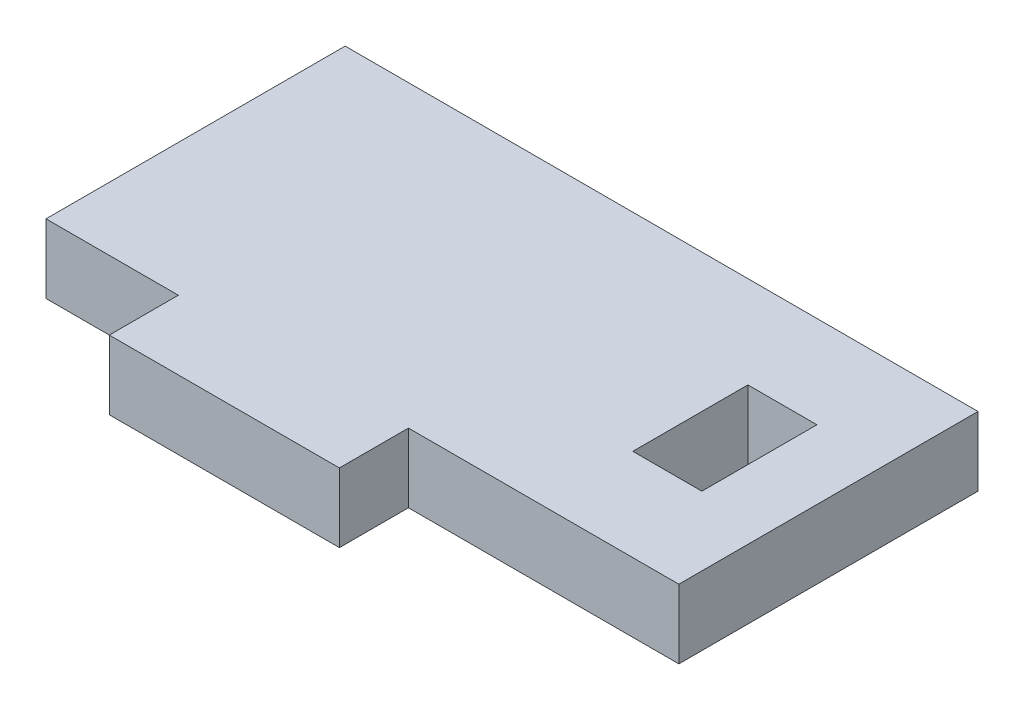
ISO-10303-21;
HEADER;
FILE_DESCRIPTION(('STEP AP214'),'2;1');
FILE_NAME('part.step','',(''),(''),'','','');
FILE_SCHEMA(('AUTOMOTIVE_DESIGN { 1 0 10303 214 1 1 1 1 }'));
ENDSEC;
DATA;
#1=APPLICATION_CONTEXT('core data for automotive mechanical design processes');
#2=APPLICATION_PROTOCOL_DEFINITION('international standard','automotive_design',2000,#1);
#3=PRODUCT_CONTEXT('',#1,'mechanical');
#4=PRODUCT('Part','Part','',(#3));
#5=PRODUCT_RELATED_PRODUCT_CATEGORY('part','',(#4));
#6=PRODUCT_DEFINITION_FORMATION('','',#4);
#7=PRODUCT_DEFINITION_CONTEXT('part definition',#1,'design');
#8=PRODUCT_DEFINITION('design','',#6,#7);
#9=PRODUCT_DEFINITION_SHAPE('','',#8);
#10=(LENGTH_UNIT() NAMED_UNIT(*) SI_UNIT(.MILLI.,.METRE.));
#11=(NAMED_UNIT(*) PLANE_ANGLE_UNIT() SI_UNIT($,.RADIAN.));
#12=(NAMED_UNIT(*) SI_UNIT($,.STERADIAN.) SOLID_ANGLE_UNIT());
#13=UNCERTAINTY_MEASURE_WITH_UNIT(LENGTH_MEASURE(1.E-05),#10,'distance_accuracy_value','');
#14=(GEOMETRIC_REPRESENTATION_CONTEXT(3) GLOBAL_UNCERTAINTY_ASSIGNED_CONTEXT((#13)) GLOBAL_UNIT_ASSIGNED_CONTEXT((#10,
#11,#12)) REPRESENTATION_CONTEXT('',''));
#15=CARTESIAN_POINT('',(0.,0.,0.));
#16=DIRECTION('',(0.,0.,1.));
#17=DIRECTION('',(1.,0.,0.));
#18=AXIS2_PLACEMENT_3D('',#15,#16,#17);
#19=CARTESIAN_POINT('',(0.,3.,0.));
#20=DIRECTION('',(0.,1.,0.));
#21=DIRECTION('',(0.,0.,1.));
#22=AXIS2_PLACEMENT_3D('',#19,#20,#21);
#23=PLANE('',#22);
#24=DIRECTION('',(0.,0.,1.));
#25=VECTOR('',#24,1.);
#26=CARTESIAN_POINT('',(-27.5,3.,-13.));
#27=LINE('',#26,#25);
#28=CARTESIAN_POINT('',(-27.5,3.,-13.));
#29=VERTEX_POINT('',#28);
#30=CARTESIAN_POINT('',(-27.5,3.,0.));
#31=VERTEX_POINT('',#30);
#32=EDGE_CURVE('E158',#29,#31,#27,.T.);
#33=ORIENTED_EDGE('',*,*,#32,.T.);
#34=DIRECTION('',(1.,0.,0.));
#35=VECTOR('',#34,1.);
#36=CARTESIAN_POINT('',(-27.5,3.,0.));
#37=LINE('',#36,#35);
#38=CARTESIAN_POINT('',(-21.75,3.,0.));
#39=VERTEX_POINT('',#38);
#40=EDGE_CURVE('E161',#31,#39,#37,.T.);
#41=ORIENTED_EDGE('',*,*,#40,.T.);
#42=DIRECTION('',(0.,0.,1.));
#43=VECTOR('',#42,1.);
#44=CARTESIAN_POINT('',(-21.75,3.,0.));
#45=LINE('',#44,#43);
#46=CARTESIAN_POINT('',(-21.75,3.,3.));
#47=VERTEX_POINT('',#46);
#48=EDGE_CURVE('E164',#39,#47,#45,.T.);
#49=ORIENTED_EDGE('',*,*,#48,.T.);
#50=DIRECTION('',(1.,0.,0.));
#51=VECTOR('',#50,1.);
#52=CARTESIAN_POINT('',(-21.75,3.,3.));
#53=LINE('',#52,#51);
#54=CARTESIAN_POINT('',(-11.75,3.,3.));
#55=VERTEX_POINT('',#54);
#56=EDGE_CURVE('E166',#47,#55,#53,.T.);
#57=ORIENTED_EDGE('',*,*,#56,.T.);
#58=DIRECTION('',(0.,0.,-1.));
#59=VECTOR('',#58,1.);
#60=CARTESIAN_POINT('',(-11.75,3.,3.));
#61=LINE('',#60,#59);
#62=CARTESIAN_POINT('',(-11.75,3.,0.));
#63=VERTEX_POINT('',#62);
#64=EDGE_CURVE('E168',#55,#63,#61,.T.);
#65=ORIENTED_EDGE('',*,*,#64,.T.);
#66=DIRECTION('',(1.,0.,0.));
#67=VECTOR('',#66,1.);
#68=CARTESIAN_POINT('',(-11.75,3.,0.));
#69=LINE('',#68,#67);
#70=CARTESIAN_POINT('',(0.,3.,0.));
#71=VERTEX_POINT('',#70);
#72=EDGE_CURVE('E170',#63,#71,#69,.T.);
#73=ORIENTED_EDGE('',*,*,#72,.T.);
#74=DIRECTION('',(0.,0.,-1.));
#75=VECTOR('',#74,1.);
#76=CARTESIAN_POINT('',(0.,3.,-13.));
#77=LINE('',#76,#75);
#78=CARTESIAN_POINT('',(0.,3.,-13.));
#79=VERTEX_POINT('',#78);
#80=EDGE_CURVE('E172',#71,#79,#77,.T.);
#81=ORIENTED_EDGE('',*,*,#80,.T.);
#82=DIRECTION('',(-1.,0.,0.));
#83=VECTOR('',#82,1.);
#84=CARTESIAN_POINT('',(-27.5,3.,-13.));
#85=LINE('',#84,#83);
#86=EDGE_CURVE('E174',#79,#29,#85,.T.);
#87=ORIENTED_EDGE('',*,*,#86,.T.);
#88=EDGE_LOOP('',(#33,#41,#49,#57,#65,#73,#81,#87));
#89=FACE_BOUND('',#88,.T.);
#90=DIRECTION('',(-1.,0.,0.));
#91=VECTOR('',#90,1.);
#92=CARTESIAN_POINT('',(-3.,3.,-9.));
#93=LINE('',#92,#91);
#94=CARTESIAN_POINT('',(-3.,3.,-9.));
#95=VERTEX_POINT('',#94);
#96=CARTESIAN_POINT('',(-6.,3.,-9.));
#97=VERTEX_POINT('',#96);
#98=EDGE_CURVE('E130',#95,#97,#93,.T.);
#99=ORIENTED_EDGE('',*,*,#98,.F.);
#100=DIRECTION('',(0.,0.,-1.));
#101=VECTOR('',#100,1.);
#102=CARTESIAN_POINT('',(-3.,3.,-4.));
#103=LINE('',#102,#101);
#104=CARTESIAN_POINT('',(-3.,3.,-4.));
#105=VERTEX_POINT('',#104);
#106=EDGE_CURVE('E122',#105,#95,#103,.T.);
#107=ORIENTED_EDGE('',*,*,#106,.F.);
#108=DIRECTION('',(1.,0.,0.));
#109=VECTOR('',#108,1.);
#110=CARTESIAN_POINT('',(-6.,3.,-4.));
#111=LINE('',#110,#109);
#112=CARTESIAN_POINT('',(-6.,3.,-4.));
#113=VERTEX_POINT('',#112);
#114=EDGE_CURVE('E144',#113,#105,#111,.T.);
#115=ORIENTED_EDGE('',*,*,#114,.F.);
#116=DIRECTION('',(0.,0.,1.));
#117=VECTOR('',#116,1.);
#118=CARTESIAN_POINT('',(-6.,3.,-9.));
#119=LINE('',#118,#117);
#120=EDGE_CURVE('E142',#97,#113,#119,.T.);
#121=ORIENTED_EDGE('',*,*,#120,.F.);
#122=EDGE_LOOP('',(#99,#107,#115,#121));
#123=FACE_BOUND('',#122,.T.);
#124=ADVANCED_FACE('F33',(#89,#123),#23,.T.);
#125=CARTESIAN_POINT('',(0.,0.,0.));
#126=DIRECTION('',(0.,1.,0.));
#127=DIRECTION('',(0.,0.,1.));
#128=AXIS2_PLACEMENT_3D('',#125,#126,#127);
#129=PLANE('',#128);
#130=DIRECTION('',(0.,0.,1.));
#131=VECTOR('',#130,1.);
#132=CARTESIAN_POINT('',(-27.5,0.,-13.));
#133=LINE('',#132,#131);
#134=CARTESIAN_POINT('',(-27.5,0.,-13.));
#135=VERTEX_POINT('',#134);
#136=CARTESIAN_POINT('',(-27.5,0.,0.));
#137=VERTEX_POINT('',#136);
#138=EDGE_CURVE('E138',#135,#137,#133,.T.);
#139=ORIENTED_EDGE('',*,*,#138,.F.);
#140=DIRECTION('',(-1.,0.,0.));
#141=VECTOR('',#140,1.);
#142=CARTESIAN_POINT('',(-27.5,0.,-13.));
#143=LINE('',#142,#141);
#144=CARTESIAN_POINT('',(0.,0.,-13.));
#145=VERTEX_POINT('',#144);
#146=EDGE_CURVE('E162',#145,#135,#143,.T.);
#147=ORIENTED_EDGE('',*,*,#146,.F.);
#148=DIRECTION('',(0.,0.,-1.));
#149=VECTOR('',#148,1.);
#150=CARTESIAN_POINT('',(0.,0.,-13.));
#151=LINE('',#150,#149);
#152=CARTESIAN_POINT('',(0.,0.,0.));
#153=VERTEX_POINT('',#152);
#154=EDGE_CURVE('E189',#153,#145,#151,.T.);
#155=ORIENTED_EDGE('',*,*,#154,.F.);
#156=DIRECTION('',(1.,0.,0.));
#157=VECTOR('',#156,1.);
#158=CARTESIAN_POINT('',(-11.75,0.,0.));
#159=LINE('',#158,#157);
#160=CARTESIAN_POINT('',(-11.75,0.,0.));
#161=VERTEX_POINT('',#160);
#162=EDGE_CURVE('E187',#161,#153,#159,.T.);
#163=ORIENTED_EDGE('',*,*,#162,.F.);
#164=DIRECTION('',(0.,0.,-1.));
#165=VECTOR('',#164,1.);
#166=CARTESIAN_POINT('',(-11.75,0.,3.));
#167=LINE('',#166,#165);
#168=CARTESIAN_POINT('',(-11.75,0.,3.));
#169=VERTEX_POINT('',#168);
#170=EDGE_CURVE('E185',#169,#161,#167,.T.);
#171=ORIENTED_EDGE('',*,*,#170,.F.);
#172=DIRECTION('',(1.,0.,0.));
#173=VECTOR('',#172,1.);
#174=CARTESIAN_POINT('',(-21.75,0.,3.));
#175=LINE('',#174,#173);
#176=CARTESIAN_POINT('',(-21.75,0.,3.));
#177=VERTEX_POINT('',#176);
#178=EDGE_CURVE('E183',#177,#169,#175,.T.);
#179=ORIENTED_EDGE('',*,*,#178,.F.);
#180=DIRECTION('',(0.,0.,1.));
#181=VECTOR('',#180,1.);
#182=CARTESIAN_POINT('',(-21.75,0.,0.));
#183=LINE('',#182,#181);
#184=CARTESIAN_POINT('',(-21.75,0.,0.));
#185=VERTEX_POINT('',#184);
#186=EDGE_CURVE('E181',#185,#177,#183,.T.);
#187=ORIENTED_EDGE('',*,*,#186,.F.);
#188=DIRECTION('',(1.,0.,0.));
#189=VECTOR('',#188,1.);
#190=CARTESIAN_POINT('',(-27.5,0.,0.));
#191=LINE('',#190,#189);
#192=EDGE_CURVE('E179',#137,#185,#191,.T.);
#193=ORIENTED_EDGE('',*,*,#192,.F.);
#194=EDGE_LOOP('',(#139,#147,#155,#163,#171,#179,#187,#193));
#195=FACE_BOUND('',#194,.T.);
#196=DIRECTION('',(0.,0.,-1.));
#197=VECTOR('',#196,1.);
#198=CARTESIAN_POINT('',(-3.,0.,-4.));
#199=LINE('',#198,#197);
#200=CARTESIAN_POINT('',(-3.,0.,-4.));
#201=VERTEX_POINT('',#200);
#202=CARTESIAN_POINT('',(-3.,0.,-9.));
#203=VERTEX_POINT('',#202);
#204=EDGE_CURVE('E56',#201,#203,#199,.T.);
#205=ORIENTED_EDGE('',*,*,#204,.T.);
#206=DIRECTION('',(-1.,0.,0.));
#207=VECTOR('',#206,1.);
#208=CARTESIAN_POINT('',(-3.,0.,-9.));
#209=LINE('',#208,#207);
#210=CARTESIAN_POINT('',(-6.,0.,-9.));
#211=VERTEX_POINT('',#210);
#212=EDGE_CURVE('E137',#203,#211,#209,.T.);
#213=ORIENTED_EDGE('',*,*,#212,.T.);
#214=DIRECTION('',(0.,0.,1.));
#215=VECTOR('',#214,1.);
#216=CARTESIAN_POINT('',(-6.,0.,-9.));
#217=LINE('',#216,#215);
#218=CARTESIAN_POINT('',(-6.,0.,-4.));
#219=VERTEX_POINT('',#218);
#220=EDGE_CURVE('E150',#211,#219,#217,.T.);
#221=ORIENTED_EDGE('',*,*,#220,.T.);
#222=DIRECTION('',(1.,0.,0.));
#223=VECTOR('',#222,1.);
#224=CARTESIAN_POINT('',(-6.,0.,-4.));
#225=LINE('',#224,#223);
#226=EDGE_CURVE('E131',#219,#201,#225,.T.);
#227=ORIENTED_EDGE('',*,*,#226,.T.);
#228=EDGE_LOOP('',(#205,#213,#221,#227));
#229=FACE_BOUND('',#228,.T.);
#230=ADVANCED_FACE('F219',(#195,#229),#129,.F.);
#231=CARTESIAN_POINT('',(-27.5,3.,-13.));
#232=DIRECTION('',(1.,0.,0.));
#233=DIRECTION('',(0.,0.,-1.));
#234=AXIS2_PLACEMENT_3D('',#231,#232,#233);
#235=PLANE('',#234);
#236=ORIENTED_EDGE('',*,*,#138,.T.);
#237=DIRECTION('',(0.,-1.,0.));
#238=VECTOR('',#237,1.);
#239=CARTESIAN_POINT('',(-27.5,3.,0.));
#240=LINE('',#239,#238);
#241=EDGE_CURVE('E11',#31,#137,#240,.T.);
#242=ORIENTED_EDGE('',*,*,#241,.F.);
#243=ORIENTED_EDGE('',*,*,#32,.F.);
#244=DIRECTION('',(0.,-1.,0.));
#245=VECTOR('',#244,1.);
#246=CARTESIAN_POINT('',(-27.5,3.,-13.));
#247=LINE('',#246,#245);
#248=EDGE_CURVE('E176',#29,#135,#247,.T.);
#249=ORIENTED_EDGE('',*,*,#248,.T.);
#250=EDGE_LOOP('',(#236,#242,#243,#249));
#251=FACE_BOUND('',#250,.T.);
#252=ADVANCED_FACE('F35',(#251),#235,.F.);
#253=CARTESIAN_POINT('',(-27.5,3.,0.));
#254=DIRECTION('',(0.,0.,-1.));
#255=DIRECTION('',(-1.,0.,0.));
#256=AXIS2_PLACEMENT_3D('',#253,#254,#255);
#257=PLANE('',#256);
#258=ORIENTED_EDGE('',*,*,#192,.T.);
#259=DIRECTION('',(0.,-1.,0.));
#260=VECTOR('',#259,1.);
#261=CARTESIAN_POINT('',(-21.75,3.,0.));
#262=LINE('',#261,#260);
#263=EDGE_CURVE('E41',#39,#185,#262,.T.);
#264=ORIENTED_EDGE('',*,*,#263,.F.);
#265=ORIENTED_EDGE('',*,*,#40,.F.);
#266=ORIENTED_EDGE('',*,*,#241,.T.);
#267=EDGE_LOOP('',(#258,#264,#265,#266));
#268=FACE_BOUND('',#267,.T.);
#269=ADVANCED_FACE('F236',(#268),#257,.F.);
#270=CARTESIAN_POINT('',(-21.75,3.,0.));
#271=DIRECTION('',(1.,0.,0.));
#272=DIRECTION('',(0.,0.,-1.));
#273=AXIS2_PLACEMENT_3D('',#270,#271,#272);
#274=PLANE('',#273);
#275=ORIENTED_EDGE('',*,*,#186,.T.);
#276=DIRECTION('',(0.,-1.,0.));
#277=VECTOR('',#276,1.);
#278=CARTESIAN_POINT('',(-21.75,3.,3.));
#279=LINE('',#278,#277);
#280=EDGE_CURVE('E206',#47,#177,#279,.T.);
#281=ORIENTED_EDGE('',*,*,#280,.F.);
#282=ORIENTED_EDGE('',*,*,#48,.F.);
#283=ORIENTED_EDGE('',*,*,#263,.T.);
#284=EDGE_LOOP('',(#275,#281,#282,#283));
#285=FACE_BOUND('',#284,.T.);
#286=ADVANCED_FACE('F213',(#285),#274,.F.);
#287=CARTESIAN_POINT('',(-21.75,3.,3.));
#288=DIRECTION('',(0.,0.,-1.));
#289=DIRECTION('',(-1.,0.,0.));
#290=AXIS2_PLACEMENT_3D('',#287,#288,#289);
#291=PLANE('',#290);
#292=ORIENTED_EDGE('',*,*,#178,.T.);
#293=DIRECTION('',(0.,-1.,0.));
#294=VECTOR('',#293,1.);
#295=CARTESIAN_POINT('',(-11.75,3.,3.));
#296=LINE('',#295,#294);
#297=EDGE_CURVE('E203',#55,#169,#296,.T.);
#298=ORIENTED_EDGE('',*,*,#297,.F.);
#299=ORIENTED_EDGE('',*,*,#56,.F.);
#300=ORIENTED_EDGE('',*,*,#280,.T.);
#301=EDGE_LOOP('',(#292,#298,#299,#300));
#302=FACE_BOUND('',#301,.T.);
#303=ADVANCED_FACE('F225',(#302),#291,.F.);
#304=CARTESIAN_POINT('',(-11.75,3.,3.));
#305=DIRECTION('',(-1.,0.,0.));
#306=DIRECTION('',(0.,0.,1.));
#307=AXIS2_PLACEMENT_3D('',#304,#305,#306);
#308=PLANE('',#307);
#309=ORIENTED_EDGE('',*,*,#170,.T.);
#310=DIRECTION('',(0.,-1.,0.));
#311=VECTOR('',#310,1.);
#312=CARTESIAN_POINT('',(-11.75,3.,0.));
#313=LINE('',#312,#311);
#314=EDGE_CURVE('E200',#63,#161,#313,.T.);
#315=ORIENTED_EDGE('',*,*,#314,.F.);
#316=ORIENTED_EDGE('',*,*,#64,.F.);
#317=ORIENTED_EDGE('',*,*,#297,.T.);
#318=EDGE_LOOP('',(#309,#315,#316,#317));
#319=FACE_BOUND('',#318,.T.);
#320=ADVANCED_FACE('F229',(#319),#308,.F.);
#321=CARTESIAN_POINT('',(-11.75,3.,0.));
#322=DIRECTION('',(0.,0.,-1.));
#323=DIRECTION('',(-1.,0.,0.));
#324=AXIS2_PLACEMENT_3D('',#321,#322,#323);
#325=PLANE('',#324);
#326=ORIENTED_EDGE('',*,*,#162,.T.);
#327=DIRECTION('',(0.,-1.,0.));
#328=VECTOR('',#327,1.);
#329=CARTESIAN_POINT('',(0.,3.,0.));
#330=LINE('',#329,#328);
#331=EDGE_CURVE('E197',#71,#153,#330,.T.);
#332=ORIENTED_EDGE('',*,*,#331,.F.);
#333=ORIENTED_EDGE('',*,*,#72,.F.);
#334=ORIENTED_EDGE('',*,*,#314,.T.);
#335=EDGE_LOOP('',(#326,#332,#333,#334));
#336=FACE_BOUND('',#335,.T.);
#337=ADVANCED_FACE('F249',(#336),#325,.F.);
#338=CARTESIAN_POINT('',(0.,3.,-13.));
#339=DIRECTION('',(-1.,0.,0.));
#340=DIRECTION('',(0.,0.,1.));
#341=AXIS2_PLACEMENT_3D('',#338,#339,#340);
#342=PLANE('',#341);
#343=ORIENTED_EDGE('',*,*,#154,.T.);
#344=DIRECTION('',(0.,-1.,0.));
#345=VECTOR('',#344,1.);
#346=CARTESIAN_POINT('',(0.,3.,-13.));
#347=LINE('',#346,#345);
#348=EDGE_CURVE('E194',#79,#145,#347,.T.);
#349=ORIENTED_EDGE('',*,*,#348,.F.);
#350=ORIENTED_EDGE('',*,*,#80,.F.);
#351=ORIENTED_EDGE('',*,*,#331,.T.);
#352=EDGE_LOOP('',(#343,#349,#350,#351));
#353=FACE_BOUND('',#352,.T.);
#354=ADVANCED_FACE('F247',(#353),#342,.F.);
#355=CARTESIAN_POINT('',(-27.5,3.,-13.));
#356=DIRECTION('',(0.,0.,1.));
#357=DIRECTION('',(1.,0.,0.));
#358=AXIS2_PLACEMENT_3D('',#355,#356,#357);
#359=PLANE('',#358);
#360=ORIENTED_EDGE('',*,*,#146,.T.);
#361=ORIENTED_EDGE('',*,*,#248,.F.);
#362=ORIENTED_EDGE('',*,*,#86,.F.);
#363=ORIENTED_EDGE('',*,*,#348,.T.);
#364=EDGE_LOOP('',(#360,#361,#362,#363));
#365=FACE_BOUND('',#364,.T.);
#366=ADVANCED_FACE('F242',(#365),#359,.F.);
#367=CARTESIAN_POINT('',(-3.,3.,-4.));
#368=DIRECTION('',(-1.,0.,0.));
#369=DIRECTION('',(0.,0.,1.));
#370=AXIS2_PLACEMENT_3D('',#367,#368,#369);
#371=PLANE('',#370);
#372=ORIENTED_EDGE('',*,*,#204,.F.);
#373=DIRECTION('',(0.,-1.,0.));
#374=VECTOR('',#373,1.);
#375=CARTESIAN_POINT('',(-3.,3.,-4.));
#376=LINE('',#375,#374);
#377=EDGE_CURVE('E126',#105,#201,#376,.T.);
#378=ORIENTED_EDGE('',*,*,#377,.F.);
#379=ORIENTED_EDGE('',*,*,#106,.T.);
#380=DIRECTION('',(0.,-1.,0.));
#381=VECTOR('',#380,1.);
#382=CARTESIAN_POINT('',(-3.,3.,-9.));
#383=LINE('',#382,#381);
#384=EDGE_CURVE('E125',#95,#203,#383,.T.);
#385=ORIENTED_EDGE('',*,*,#384,.T.);
#386=EDGE_LOOP('',(#372,#378,#379,#385));
#387=FACE_BOUND('',#386,.T.);
#388=ADVANCED_FACE('F124',(#387),#371,.T.);
#389=CARTESIAN_POINT('',(-3.,3.,-9.));
#390=DIRECTION('',(0.,0.,1.));
#391=DIRECTION('',(1.,0.,0.));
#392=AXIS2_PLACEMENT_3D('',#389,#390,#391);
#393=PLANE('',#392);
#394=ORIENTED_EDGE('',*,*,#212,.F.);
#395=ORIENTED_EDGE('',*,*,#384,.F.);
#396=ORIENTED_EDGE('',*,*,#98,.T.);
#397=DIRECTION('',(0.,-1.,0.));
#398=VECTOR('',#397,1.);
#399=CARTESIAN_POINT('',(-6.,3.,-9.));
#400=LINE('',#399,#398);
#401=EDGE_CURVE('E139',#97,#211,#400,.T.);
#402=ORIENTED_EDGE('',*,*,#401,.T.);
#403=EDGE_LOOP('',(#394,#395,#396,#402));
#404=FACE_BOUND('',#403,.T.);
#405=ADVANCED_FACE('F134',(#404),#393,.T.);
#406=CARTESIAN_POINT('',(-6.,3.,-9.));
#407=DIRECTION('',(1.,0.,0.));
#408=DIRECTION('',(0.,0.,-1.));
#409=AXIS2_PLACEMENT_3D('',#406,#407,#408);
#410=PLANE('',#409);
#411=ORIENTED_EDGE('',*,*,#220,.F.);
#412=ORIENTED_EDGE('',*,*,#401,.F.);
#413=ORIENTED_EDGE('',*,*,#120,.T.);
#414=DIRECTION('',(0.,-1.,0.));
#415=VECTOR('',#414,1.);
#416=CARTESIAN_POINT('',(-6.,3.,-4.));
#417=LINE('',#416,#415);
#418=EDGE_CURVE('E48',#113,#219,#417,.T.);
#419=ORIENTED_EDGE('',*,*,#418,.T.);
#420=EDGE_LOOP('',(#411,#412,#413,#419));
#421=FACE_BOUND('',#420,.T.);
#422=ADVANCED_FACE('F274',(#421),#410,.T.);
#423=CARTESIAN_POINT('',(-6.,3.,-4.));
#424=DIRECTION('',(0.,0.,-1.));
#425=DIRECTION('',(-1.,0.,0.));
#426=AXIS2_PLACEMENT_3D('',#423,#424,#425);
#427=PLANE('',#426);
#428=ORIENTED_EDGE('',*,*,#226,.F.);
#429=ORIENTED_EDGE('',*,*,#418,.F.);
#430=ORIENTED_EDGE('',*,*,#114,.T.);
#431=ORIENTED_EDGE('',*,*,#377,.T.);
#432=EDGE_LOOP('',(#428,#429,#430,#431));
#433=FACE_BOUND('',#432,.T.);
#434=ADVANCED_FACE('F278',(#433),#427,.T.);
#435=CLOSED_SHELL('',(#124,#230,#252,#269,#286,#303,#320,#337,#354,#366,#388,#405,#422,#434));
#436=MANIFOLD_SOLID_BREP('B2',#435);
#437=ADVANCED_BREP_SHAPE_REPRESENTATION('',(#18,#436),#14);
#438=SHAPE_DEFINITION_REPRESENTATION(#9,#437);
ENDSEC;
END-ISO-10303-21;
